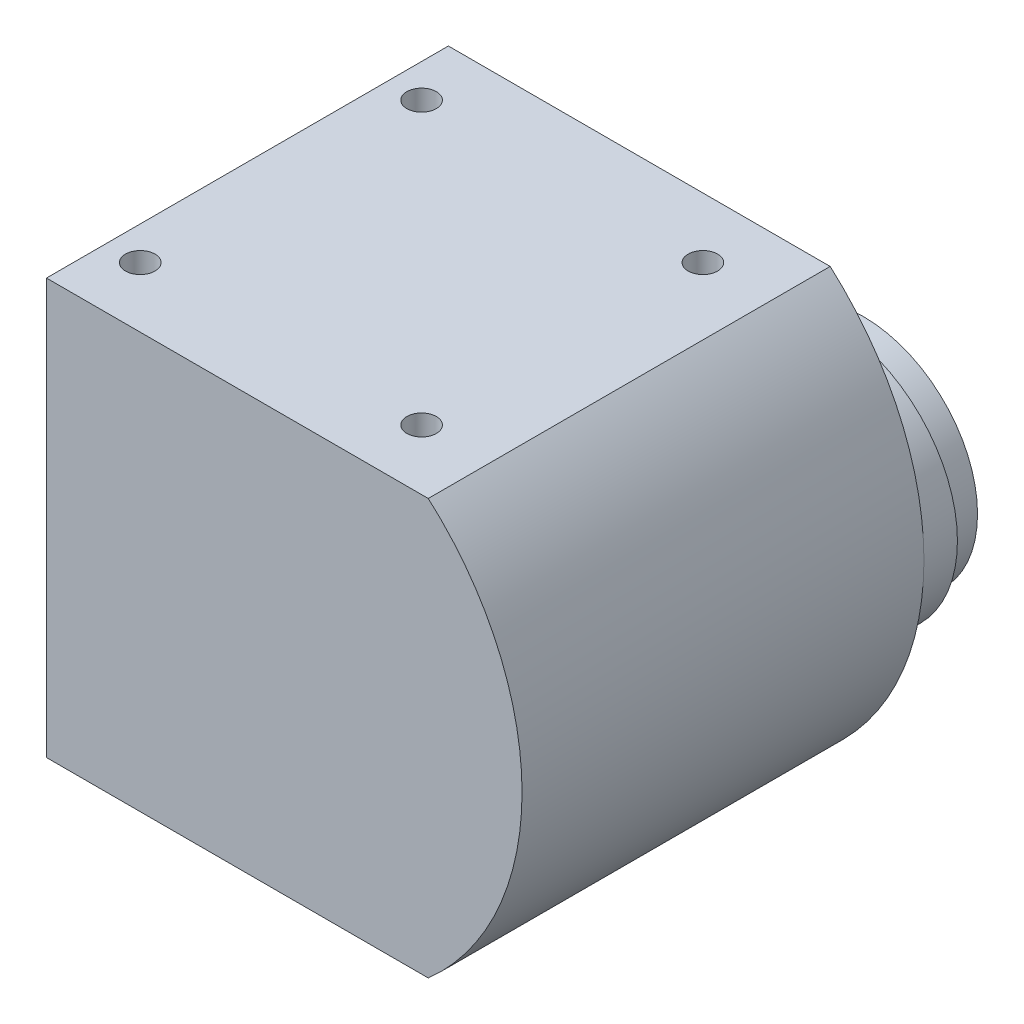
ISO-10303-21;
HEADER;
FILE_DESCRIPTION(('STEP AP214'),'2;1');
FILE_NAME('part.step','',(''),(''),'','','');
FILE_SCHEMA(('AUTOMOTIVE_DESIGN { 1 0 10303 214 1 1 1 1 }'));
ENDSEC;
DATA;
#1=APPLICATION_CONTEXT('core data for automotive mechanical design processes');
#2=APPLICATION_PROTOCOL_DEFINITION('international standard','automotive_design',2000,#1);
#3=PRODUCT_CONTEXT('',#1,'mechanical');
#4=PRODUCT('Part','Part','',(#3));
#5=PRODUCT_RELATED_PRODUCT_CATEGORY('part','',(#4));
#6=PRODUCT_DEFINITION_FORMATION('','',#4);
#7=PRODUCT_DEFINITION_CONTEXT('part definition',#1,'design');
#8=PRODUCT_DEFINITION('design','',#6,#7);
#9=PRODUCT_DEFINITION_SHAPE('','',#8);
#10=(LENGTH_UNIT() NAMED_UNIT(*) SI_UNIT(.MILLI.,.METRE.));
#11=(NAMED_UNIT(*) PLANE_ANGLE_UNIT() SI_UNIT($,.RADIAN.));
#12=(NAMED_UNIT(*) SI_UNIT($,.STERADIAN.) SOLID_ANGLE_UNIT());
#13=UNCERTAINTY_MEASURE_WITH_UNIT(LENGTH_MEASURE(1.E-05),#10,'distance_accuracy_value','');
#14=(GEOMETRIC_REPRESENTATION_CONTEXT(3) GLOBAL_UNCERTAINTY_ASSIGNED_CONTEXT((#13)) GLOBAL_UNIT_ASSIGNED_CONTEXT((#10,
#11,#12)) REPRESENTATION_CONTEXT('',''));
#15=CARTESIAN_POINT('',(0.,0.,0.));
#16=DIRECTION('',(0.,0.,1.));
#17=DIRECTION('',(1.,0.,0.));
#18=AXIS2_PLACEMENT_3D('',#15,#16,#17);
#19=CARTESIAN_POINT('',(-26.,13.,33.));
#20=DIRECTION('',(0.,1.,0.));
#21=DIRECTION('',(0.,0.,1.));
#22=AXIS2_PLACEMENT_3D('',#19,#20,#21);
#23=PLANE('',#22);
#24=CARTESIAN_POINT('',(-23.4999999999998,13.,30.4999999999999));
#25=DIRECTION('',(0.,1.,0.));
#26=DIRECTION('',(0.,0.,1.));
#27=AXIS2_PLACEMENT_3D('',#24,#25,#26);
#28=CIRCLE('',#27,1.1);
#29=CARTESIAN_POINT('',(-23.4999999999998,13.,31.5999999999999));
#30=VERTEX_POINT('',#29);
#31=EDGE_CURVE('E132',#30,#30,#28,.T.);
#32=ORIENTED_EDGE('',*,*,#31,.T.);
#33=EDGE_LOOP('',(#32));
#34=FACE_BOUND('',#33,.T.);
#35=CARTESIAN_POINT('',(-2.49999999999978,13.,30.4999999999998));
#36=DIRECTION('',(0.,1.,0.));
#37=DIRECTION('',(0.,0.,1.));
#38=AXIS2_PLACEMENT_3D('',#35,#36,#37);
#39=CIRCLE('',#38,1.1);
#40=CARTESIAN_POINT('',(-2.49999999999978,13.,31.5999999999998));
#41=VERTEX_POINT('',#40);
#42=EDGE_CURVE('E290',#41,#41,#39,.T.);
#43=ORIENTED_EDGE('',*,*,#42,.T.);
#44=EDGE_LOOP('',(#43));
#45=FACE_BOUND('',#44,.T.);
#46=CARTESIAN_POINT('',(-2.49999999999996,13.,9.49999999999974));
#47=DIRECTION('',(0.,1.,0.));
#48=DIRECTION('',(0.,0.,1.));
#49=AXIS2_PLACEMENT_3D('',#46,#47,#48);
#50=CIRCLE('',#49,1.1);
#51=CARTESIAN_POINT('',(-2.49999999999996,13.,10.5999999999997));
#52=VERTEX_POINT('',#51);
#53=EDGE_CURVE('E277',#52,#52,#50,.T.);
#54=ORIENTED_EDGE('',*,*,#53,.T.);
#55=EDGE_LOOP('',(#54));
#56=FACE_BOUND('',#55,.T.);
#57=CARTESIAN_POINT('',(-23.5,13.,9.5));
#58=DIRECTION('',(0.,1.,0.));
#59=DIRECTION('',(0.,0.,1.));
#60=AXIS2_PLACEMENT_3D('',#57,#58,#59);
#61=CIRCLE('',#60,1.1);
#62=CARTESIAN_POINT('',(-23.5,13.,10.6));
#63=VERTEX_POINT('',#62);
#64=EDGE_CURVE('E278',#63,#63,#61,.T.);
#65=ORIENTED_EDGE('',*,*,#64,.T.);
#66=EDGE_LOOP('',(#65));
#67=FACE_BOUND('',#66,.T.);
#68=DIRECTION('',(1.,0.,0.));
#69=VECTOR('',#68,1.);
#70=CARTESIAN_POINT('',(0.,13.,7.));
#71=LINE('',#70,#69);
#72=CARTESIAN_POINT('',(-26.,13.,7.));
#73=VERTEX_POINT('',#72);
#74=CARTESIAN_POINT('',(0.,13.,7.));
#75=VERTEX_POINT('',#74);
#76=EDGE_CURVE('E48',#73,#75,#71,.T.);
#77=ORIENTED_EDGE('',*,*,#76,.T.);
#78=DIRECTION('',(0.,0.,-1.));
#79=VECTOR('',#78,1.);
#80=CARTESIAN_POINT('',(0.,13.,33.));
#81=LINE('',#80,#79);
#82=CARTESIAN_POINT('',(0.,13.,33.));
#83=VERTEX_POINT('',#82);
#84=EDGE_CURVE('E176',#83,#75,#81,.T.);
#85=ORIENTED_EDGE('',*,*,#84,.F.);
#86=DIRECTION('',(1.,0.,0.));
#87=VECTOR('',#86,1.);
#88=CARTESIAN_POINT('',(-26.,13.,33.));
#89=LINE('',#88,#87);
#90=CARTESIAN_POINT('',(-26.,13.,33.));
#91=VERTEX_POINT('',#90);
#92=EDGE_CURVE('E147',#91,#83,#89,.T.);
#93=ORIENTED_EDGE('',*,*,#92,.F.);
#94=DIRECTION('',(0.,0.,-1.));
#95=VECTOR('',#94,1.);
#96=CARTESIAN_POINT('',(-26.,13.,33.));
#97=LINE('',#96,#95);
#98=EDGE_CURVE('E157',#91,#73,#97,.T.);
#99=ORIENTED_EDGE('',*,*,#98,.T.);
#100=EDGE_LOOP('',(#77,#85,#93,#99));
#101=FACE_BOUND('',#100,.T.);
#102=ADVANCED_FACE('F33',(#34,#45,#56,#67,#101),#23,.F.);
#103=CARTESIAN_POINT('',(0.,13.,33.));
#104=DIRECTION('',(1.,0.,0.));
#105=DIRECTION('',(0.,0.,-1.));
#106=AXIS2_PLACEMENT_3D('',#103,#104,#105);
#107=PLANE('',#106);
#108=DIRECTION('',(0.,-1.,0.));
#109=VECTOR('',#108,1.);
#110=CARTESIAN_POINT('',(0.,13.,7.));
#111=LINE('',#110,#109);
#112=CARTESIAN_POINT('',(0.,-13.,7.));
#113=VERTEX_POINT('',#112);
#114=EDGE_CURVE('E55',#75,#113,#111,.T.);
#115=ORIENTED_EDGE('',*,*,#114,.T.);
#116=DIRECTION('',(0.,0.,-1.));
#117=VECTOR('',#116,1.);
#118=CARTESIAN_POINT('',(0.,-13.,33.));
#119=LINE('',#118,#117);
#120=CARTESIAN_POINT('',(0.,-13.,33.));
#121=VERTEX_POINT('',#120);
#122=EDGE_CURVE('E174',#121,#113,#119,.T.);
#123=ORIENTED_EDGE('',*,*,#122,.F.);
#124=DIRECTION('',(0.,-1.,0.));
#125=VECTOR('',#124,1.);
#126=CARTESIAN_POINT('',(0.,13.,33.));
#127=LINE('',#126,#125);
#128=EDGE_CURVE('E150',#83,#121,#127,.T.);
#129=ORIENTED_EDGE('',*,*,#128,.F.);
#130=ORIENTED_EDGE('',*,*,#84,.T.);
#131=EDGE_LOOP('',(#115,#123,#129,#130));
#132=FACE_BOUND('',#131,.T.);
#133=ADVANCED_FACE('F203',(#132),#107,.F.);
#134=CARTESIAN_POINT('',(0.,-13.,33.));
#135=DIRECTION('',(0.,-1.,0.));
#136=DIRECTION('',(0.,0.,-1.));
#137=AXIS2_PLACEMENT_3D('',#134,#135,#136);
#138=PLANE('',#137);
#139=CARTESIAN_POINT('',(-23.4999999999998,-13.,30.4999999999999));
#140=DIRECTION('',(0.,-1.,0.));
#141=DIRECTION('',(0.,0.,-1.));
#142=AXIS2_PLACEMENT_3D('',#139,#140,#141);
#143=CIRCLE('',#142,1.1);
#144=CARTESIAN_POINT('',(-23.4999999999998,-13.,29.3999999999999));
#145=VERTEX_POINT('',#144);
#146=EDGE_CURVE('E292',#145,#145,#143,.T.);
#147=ORIENTED_EDGE('',*,*,#146,.T.);
#148=EDGE_LOOP('',(#147));
#149=FACE_BOUND('',#148,.T.);
#150=CARTESIAN_POINT('',(-2.49999999999978,-13.,30.4999999999998));
#151=DIRECTION('',(0.,-1.,0.));
#152=DIRECTION('',(0.,0.,-1.));
#153=AXIS2_PLACEMENT_3D('',#150,#151,#152);
#154=CIRCLE('',#153,1.1);
#155=CARTESIAN_POINT('',(-2.49999999999978,-13.,29.3999999999998));
#156=VERTEX_POINT('',#155);
#157=EDGE_CURVE('E281',#156,#156,#154,.T.);
#158=ORIENTED_EDGE('',*,*,#157,.T.);
#159=EDGE_LOOP('',(#158));
#160=FACE_BOUND('',#159,.T.);
#161=CARTESIAN_POINT('',(-2.49999999999996,-13.,9.49999999999974));
#162=DIRECTION('',(0.,-1.,0.));
#163=DIRECTION('',(0.,0.,-1.));
#164=AXIS2_PLACEMENT_3D('',#161,#162,#163);
#165=CIRCLE('',#164,1.1);
#166=CARTESIAN_POINT('',(-2.49999999999996,-13.,8.39999999999974));
#167=VERTEX_POINT('',#166);
#168=EDGE_CURVE('E275',#167,#167,#165,.T.);
#169=ORIENTED_EDGE('',*,*,#168,.T.);
#170=EDGE_LOOP('',(#169));
#171=FACE_BOUND('',#170,.T.);
#172=CARTESIAN_POINT('',(-23.5,-13.,9.5));
#173=DIRECTION('',(0.,-1.,0.));
#174=DIRECTION('',(0.,0.,-1.));
#175=AXIS2_PLACEMENT_3D('',#172,#173,#174);
#176=CIRCLE('',#175,1.1);
#177=CARTESIAN_POINT('',(-23.5,-13.,8.4));
#178=VERTEX_POINT('',#177);
#179=EDGE_CURVE('E284',#178,#178,#176,.T.);
#180=ORIENTED_EDGE('',*,*,#179,.T.);
#181=EDGE_LOOP('',(#180));
#182=FACE_BOUND('',#181,.T.);
#183=DIRECTION('',(-1.,0.,0.));
#184=VECTOR('',#183,1.);
#185=CARTESIAN_POINT('',(0.,-13.,7.));
#186=LINE('',#185,#184);
#187=CARTESIAN_POINT('',(-26.,-13.,7.));
#188=VERTEX_POINT('',#187);
#189=EDGE_CURVE('E140',#113,#188,#186,.T.);
#190=ORIENTED_EDGE('',*,*,#189,.T.);
#191=DIRECTION('',(0.,0.,-1.));
#192=VECTOR('',#191,1.);
#193=CARTESIAN_POINT('',(-26.,-13.,33.));
#194=LINE('',#193,#192);
#195=CARTESIAN_POINT('',(-26.,-13.,33.));
#196=VERTEX_POINT('',#195);
#197=EDGE_CURVE('E171',#196,#188,#194,.T.);
#198=ORIENTED_EDGE('',*,*,#197,.F.);
#199=DIRECTION('',(-1.,0.,0.));
#200=VECTOR('',#199,1.);
#201=CARTESIAN_POINT('',(0.,-13.,33.));
#202=LINE('',#201,#200);
#203=EDGE_CURVE('E154',#121,#196,#202,.T.);
#204=ORIENTED_EDGE('',*,*,#203,.F.);
#205=ORIENTED_EDGE('',*,*,#122,.T.);
#206=EDGE_LOOP('',(#190,#198,#204,#205));
#207=FACE_BOUND('',#206,.T.);
#208=ADVANCED_FACE('F208',(#149,#160,#171,#182,#207),#138,.F.);
#209=CARTESIAN_POINT('',(0.,0.,2.5));
#210=DIRECTION('',(0.,0.,-1.));
#211=DIRECTION('',(-1.,0.,0.));
#212=AXIS2_PLACEMENT_3D('',#209,#210,#211);
#213=CYLINDRICAL_SURFACE('',#212,8.5);
#214=CARTESIAN_POINT('',(0.,0.,2.5));
#215=DIRECTION('',(0.,0.,1.));
#216=DIRECTION('',(1.,0.,0.));
#217=AXIS2_PLACEMENT_3D('',#214,#215,#216);
#218=CIRCLE('',#217,8.5);
#219=CARTESIAN_POINT('',(8.5,0.,2.5));
#220=VERTEX_POINT('',#219);
#221=EDGE_CURVE('E11',#220,#220,#218,.T.);
#222=ORIENTED_EDGE('',*,*,#221,.F.);
#223=EDGE_LOOP('',(#222));
#224=FACE_BOUND('',#223,.T.);
#225=CARTESIAN_POINT('',(0.,0.,0.));
#226=DIRECTION('',(0.,0.,1.));
#227=DIRECTION('',(1.,0.,0.));
#228=AXIS2_PLACEMENT_3D('',#225,#226,#227);
#229=CIRCLE('',#228,8.5);
#230=CARTESIAN_POINT('',(8.5,0.,0.));
#231=VERTEX_POINT('',#230);
#232=EDGE_CURVE('E37',#231,#231,#229,.T.);
#233=ORIENTED_EDGE('',*,*,#232,.T.);
#234=EDGE_LOOP('',(#233));
#235=FACE_BOUND('',#234,.T.);
#236=ADVANCED_FACE('F35',(#224,#235),#213,.T.);
#237=CARTESIAN_POINT('',(0.,0.,0.));
#238=DIRECTION('',(0.,0.,1.));
#239=DIRECTION('',(1.,0.,0.));
#240=AXIS2_PLACEMENT_3D('',#237,#238,#239);
#241=PLANE('',#240);
#242=ORIENTED_EDGE('',*,*,#232,.F.);
#243=EDGE_LOOP('',(#242));
#244=FACE_BOUND('',#243,.T.);
#245=ADVANCED_FACE('F198',(#244),#241,.F.);
#246=CARTESIAN_POINT('',(0.,0.,5.));
#247=DIRECTION('',(0.,0.,-1.));
#248=DIRECTION('',(-1.,0.,0.));
#249=AXIS2_PLACEMENT_3D('',#246,#247,#248);
#250=CYLINDRICAL_SURFACE('',#249,9.5);
#251=CARTESIAN_POINT('',(0.,0.,5.));
#252=DIRECTION('',(0.,0.,1.));
#253=DIRECTION('',(1.,0.,0.));
#254=AXIS2_PLACEMENT_3D('',#251,#252,#253);
#255=CIRCLE('',#254,9.5);
#256=CARTESIAN_POINT('',(9.5,0.,5.));
#257=VERTEX_POINT('',#256);
#258=EDGE_CURVE('E179',#257,#257,#255,.T.);
#259=ORIENTED_EDGE('',*,*,#258,.F.);
#260=EDGE_LOOP('',(#259));
#261=FACE_BOUND('',#260,.T.);
#262=CARTESIAN_POINT('',(0.,0.,2.5));
#263=DIRECTION('',(0.,0.,1.));
#264=DIRECTION('',(1.,0.,0.));
#265=AXIS2_PLACEMENT_3D('',#262,#263,#264);
#266=CIRCLE('',#265,9.5);
#267=CARTESIAN_POINT('',(9.5,0.,2.5));
#268=VERTEX_POINT('',#267);
#269=EDGE_CURVE('E178',#268,#268,#266,.T.);
#270=ORIENTED_EDGE('',*,*,#269,.T.);
#271=EDGE_LOOP('',(#270));
#272=FACE_BOUND('',#271,.T.);
#273=ADVANCED_FACE('F184',(#261,#272),#250,.T.);
#274=CARTESIAN_POINT('',(0.,0.,2.5));
#275=DIRECTION('',(0.,0.,1.));
#276=DIRECTION('',(1.,0.,0.));
#277=AXIS2_PLACEMENT_3D('',#274,#275,#276);
#278=PLANE('',#277);
#279=ORIENTED_EDGE('',*,*,#221,.T.);
#280=EDGE_LOOP('',(#279));
#281=FACE_BOUND('',#280,.T.);
#282=ORIENTED_EDGE('',*,*,#269,.F.);
#283=EDGE_LOOP('',(#282));
#284=FACE_BOUND('',#283,.T.);
#285=ADVANCED_FACE('F186',(#281,#284),#278,.F.);
#286=CARTESIAN_POINT('',(-11.1607142857142,0.,5.));
#287=DIRECTION('',(0.,0.,1.));
#288=DIRECTION('',(1.,0.,0.));
#289=AXIS2_PLACEMENT_3D('',#286,#287,#288);
#290=PLANE('',#289);
#291=CARTESIAN_POINT('',(-11.1607142857142,0.,5.));
#292=DIRECTION('',(0.,0.,1.));
#293=DIRECTION('',(1.,0.,0.));
#294=AXIS2_PLACEMENT_3D('',#291,#292,#293);
#295=CIRCLE('',#294,20.6607142857142);
#296=CARTESIAN_POINT('',(2.5,15.5,5.));
#297=VERTEX_POINT('',#296);
#298=EDGE_CURVE('E160',#257,#297,#295,.T.);
#299=ORIENTED_EDGE('',*,*,#298,.F.);
#300=ORIENTED_EDGE('',*,*,#258,.T.);
#301=CARTESIAN_POINT('',(2.50000000000001,-15.5,5.));
#302=VERTEX_POINT('',#301);
#303=EDGE_CURVE('E161',#302,#257,#295,.T.);
#304=ORIENTED_EDGE('',*,*,#303,.F.);
#305=DIRECTION('',(1.,0.,0.));
#306=VECTOR('',#305,1.);
#307=CARTESIAN_POINT('',(2.5,-15.5,5.));
#308=LINE('',#307,#306);
#309=CARTESIAN_POINT('',(-26.,-15.5,5.));
#310=VERTEX_POINT('',#309);
#311=EDGE_CURVE('E109',#310,#302,#308,.T.);
#312=ORIENTED_EDGE('',*,*,#311,.F.);
#313=DIRECTION('',(0.,-1.,0.));
#314=VECTOR('',#313,1.);
#315=CARTESIAN_POINT('',(-26.,-13.,5.));
#316=LINE('',#315,#314);
#317=CARTESIAN_POINT('',(-26.,15.5,5.));
#318=VERTEX_POINT('',#317);
#319=EDGE_CURVE('E146',#318,#310,#316,.T.);
#320=ORIENTED_EDGE('',*,*,#319,.F.);
#321=DIRECTION('',(-1.,0.,0.));
#322=VECTOR('',#321,1.);
#323=CARTESIAN_POINT('',(-26.,15.5,5.));
#324=LINE('',#323,#322);
#325=EDGE_CURVE('E151',#297,#318,#324,.T.);
#326=ORIENTED_EDGE('',*,*,#325,.F.);
#327=EDGE_LOOP('',(#299,#300,#304,#312,#320,#326));
#328=FACE_BOUND('',#327,.T.);
#329=ADVANCED_FACE('F188',(#328),#290,.F.);
#330=CARTESIAN_POINT('',(-26.,-13.,33.));
#331=DIRECTION('',(1.,0.,0.));
#332=DIRECTION('',(0.,0.,-1.));
#333=AXIS2_PLACEMENT_3D('',#330,#331,#332);
#334=PLANE('',#333);
#335=DIRECTION('',(0.,0.,-1.));
#336=VECTOR('',#335,1.);
#337=CARTESIAN_POINT('',(-26.,-15.5,33.));
#338=LINE('',#337,#336);
#339=CARTESIAN_POINT('',(-26.,-15.5,35.));
#340=VERTEX_POINT('',#339);
#341=EDGE_CURVE('E113',#340,#310,#338,.T.);
#342=ORIENTED_EDGE('',*,*,#341,.F.);
#343=DIRECTION('',(0.,-1.,0.));
#344=VECTOR('',#343,1.);
#345=CARTESIAN_POINT('',(-26.,15.5,35.));
#346=LINE('',#345,#344);
#347=CARTESIAN_POINT('',(-26.,15.5,35.));
#348=VERTEX_POINT('',#347);
#349=EDGE_CURVE('E128',#348,#340,#346,.T.);
#350=ORIENTED_EDGE('',*,*,#349,.F.);
#351=DIRECTION('',(0.,0.,-1.));
#352=VECTOR('',#351,1.);
#353=CARTESIAN_POINT('',(-26.,15.5,33.));
#354=LINE('',#353,#352);
#355=EDGE_CURVE('E166',#348,#318,#354,.T.);
#356=ORIENTED_EDGE('',*,*,#355,.T.);
#357=ORIENTED_EDGE('',*,*,#319,.T.);
#358=EDGE_LOOP('',(#342,#350,#356,#357));
#359=FACE_BOUND('',#358,.T.);
#360=DIRECTION('',(0.,-1.,0.));
#361=VECTOR('',#360,1.);
#362=CARTESIAN_POINT('',(-26.,15.5,33.));
#363=LINE('',#362,#361);
#364=EDGE_CURVE('E129',#91,#196,#363,.T.);
#365=ORIENTED_EDGE('',*,*,#364,.T.);
#366=ORIENTED_EDGE('',*,*,#197,.T.);
#367=DIRECTION('',(0.,1.,0.));
#368=VECTOR('',#367,1.);
#369=CARTESIAN_POINT('',(-26.,13.,7.));
#370=LINE('',#369,#368);
#371=EDGE_CURVE('E142',#188,#73,#370,.T.);
#372=ORIENTED_EDGE('',*,*,#371,.T.);
#373=ORIENTED_EDGE('',*,*,#98,.F.);
#374=EDGE_LOOP('',(#365,#366,#372,#373));
#375=FACE_BOUND('',#374,.T.);
#376=ADVANCED_FACE('F195',(#359,#375),#334,.F.);
#377=CARTESIAN_POINT('',(2.5,-15.5,33.));
#378=DIRECTION('',(0.,1.,0.));
#379=DIRECTION('',(-1.,0.,0.));
#380=AXIS2_PLACEMENT_3D('',#377,#378,#379);
#381=PLANE('',#380);
#382=CARTESIAN_POINT('',(-23.4999999999998,-15.5,30.4999999999999));
#383=DIRECTION('',(0.,1.,0.));
#384=DIRECTION('',(-1.,0.,0.));
#385=AXIS2_PLACEMENT_3D('',#382,#383,#384);
#386=CIRCLE('',#385,1.1);
#387=CARTESIAN_POINT('',(-24.5999999999998,-15.5,30.4999999999999));
#388=VERTEX_POINT('',#387);
#389=EDGE_CURVE('E305',#388,#388,#386,.T.);
#390=ORIENTED_EDGE('',*,*,#389,.T.);
#391=EDGE_LOOP('',(#390));
#392=FACE_BOUND('',#391,.T.);
#393=CARTESIAN_POINT('',(-2.49999999999978,-15.5,30.4999999999998));
#394=DIRECTION('',(0.,1.,0.));
#395=DIRECTION('',(-1.,0.,0.));
#396=AXIS2_PLACEMENT_3D('',#393,#394,#395);
#397=CIRCLE('',#396,1.1);
#398=CARTESIAN_POINT('',(-3.59999999999978,-15.5,30.4999999999998));
#399=VERTEX_POINT('',#398);
#400=EDGE_CURVE('E310',#399,#399,#397,.T.);
#401=ORIENTED_EDGE('',*,*,#400,.T.);
#402=EDGE_LOOP('',(#401));
#403=FACE_BOUND('',#402,.T.);
#404=CARTESIAN_POINT('',(-2.49999999999996,-15.5,9.49999999999974));
#405=DIRECTION('',(0.,1.,0.));
#406=DIRECTION('',(-1.,0.,0.));
#407=AXIS2_PLACEMENT_3D('',#404,#405,#406);
#408=CIRCLE('',#407,1.1);
#409=CARTESIAN_POINT('',(-3.59999999999996,-15.5,9.49999999999974));
#410=VERTEX_POINT('',#409);
#411=EDGE_CURVE('E272',#410,#410,#408,.T.);
#412=ORIENTED_EDGE('',*,*,#411,.T.);
#413=EDGE_LOOP('',(#412));
#414=FACE_BOUND('',#413,.T.);
#415=CARTESIAN_POINT('',(-23.5,-15.5,9.5));
#416=DIRECTION('',(0.,1.,0.));
#417=DIRECTION('',(-1.,0.,0.));
#418=AXIS2_PLACEMENT_3D('',#415,#416,#417);
#419=CIRCLE('',#418,1.1);
#420=CARTESIAN_POINT('',(-24.6,-15.5,9.5));
#421=VERTEX_POINT('',#420);
#422=EDGE_CURVE('E316',#421,#421,#419,.T.);
#423=ORIENTED_EDGE('',*,*,#422,.T.);
#424=EDGE_LOOP('',(#423));
#425=FACE_BOUND('',#424,.T.);
#426=ORIENTED_EDGE('',*,*,#311,.T.);
#427=DIRECTION('',(0.,0.,-1.));
#428=VECTOR('',#427,1.);
#429=CARTESIAN_POINT('',(2.50000000000001,-15.5,33.));
#430=LINE('',#429,#428);
#431=CARTESIAN_POINT('',(2.50000000000001,-15.5,35.));
#432=VERTEX_POINT('',#431);
#433=EDGE_CURVE('E102',#432,#302,#430,.T.);
#434=ORIENTED_EDGE('',*,*,#433,.F.);
#435=DIRECTION('',(1.,0.,0.));
#436=VECTOR('',#435,1.);
#437=CARTESIAN_POINT('',(-26.,-15.5,35.));
#438=LINE('',#437,#436);
#439=EDGE_CURVE('E107',#340,#432,#438,.T.);
#440=ORIENTED_EDGE('',*,*,#439,.F.);
#441=ORIENTED_EDGE('',*,*,#341,.T.);
#442=EDGE_LOOP('',(#426,#434,#440,#441));
#443=FACE_BOUND('',#442,.T.);
#444=ADVANCED_FACE('F104',(#392,#403,#414,#425,#443),#381,.F.);
#445=CARTESIAN_POINT('',(-11.1607142857142,0.,33.));
#446=DIRECTION('',(0.,0.,-1.));
#447=DIRECTION('',(-1.,0.,0.));
#448=AXIS2_PLACEMENT_3D('',#445,#446,#447);
#449=CYLINDRICAL_SURFACE('',#448,20.6607142857142);
#450=ORIENTED_EDGE('',*,*,#303,.T.);
#451=ORIENTED_EDGE('',*,*,#298,.T.);
#452=DIRECTION('',(0.,0.,-1.));
#453=VECTOR('',#452,1.);
#454=CARTESIAN_POINT('',(2.5,15.5,33.));
#455=LINE('',#454,#453);
#456=CARTESIAN_POINT('',(2.5,15.5,35.));
#457=VERTEX_POINT('',#456);
#458=EDGE_CURVE('E114',#457,#297,#455,.T.);
#459=ORIENTED_EDGE('',*,*,#458,.F.);
#460=CARTESIAN_POINT('',(-11.1607142857142,0.,35.));
#461=DIRECTION('',(0.,0.,1.));
#462=DIRECTION('',(1.,0.,0.));
#463=AXIS2_PLACEMENT_3D('',#460,#461,#462);
#464=CIRCLE('',#463,20.6607142857142);
#465=EDGE_CURVE('E117',#432,#457,#464,.T.);
#466=ORIENTED_EDGE('',*,*,#465,.F.);
#467=ORIENTED_EDGE('',*,*,#433,.T.);
#468=EDGE_LOOP('',(#450,#451,#459,#466,#467));
#469=FACE_BOUND('',#468,.T.);
#470=ADVANCED_FACE('F118',(#469),#449,.T.);
#471=CARTESIAN_POINT('',(-26.,15.5,33.));
#472=DIRECTION('',(0.,-1.,0.));
#473=DIRECTION('',(1.,0.,0.));
#474=AXIS2_PLACEMENT_3D('',#471,#472,#473);
#475=PLANE('',#474);
#476=CARTESIAN_POINT('',(-23.4999999999998,15.5,30.4999999999999));
#477=DIRECTION('',(0.,1.,0.));
#478=DIRECTION('',(-1.,0.,0.));
#479=AXIS2_PLACEMENT_3D('',#476,#477,#478);
#480=CIRCLE('',#479,1.1);
#481=CARTESIAN_POINT('',(-24.5999999999998,15.5,30.4999999999999));
#482=VERTEX_POINT('',#481);
#483=EDGE_CURVE('E307',#482,#482,#480,.T.);
#484=ORIENTED_EDGE('',*,*,#483,.F.);
#485=EDGE_LOOP('',(#484));
#486=FACE_BOUND('',#485,.T.);
#487=CARTESIAN_POINT('',(-2.49999999999978,15.5,30.4999999999998));
#488=DIRECTION('',(0.,1.,0.));
#489=DIRECTION('',(-1.,0.,0.));
#490=AXIS2_PLACEMENT_3D('',#487,#488,#489);
#491=CIRCLE('',#490,1.1);
#492=CARTESIAN_POINT('',(-3.59999999999978,15.5,30.4999999999998));
#493=VERTEX_POINT('',#492);
#494=EDGE_CURVE('E306',#493,#493,#491,.T.);
#495=ORIENTED_EDGE('',*,*,#494,.F.);
#496=EDGE_LOOP('',(#495));
#497=FACE_BOUND('',#496,.T.);
#498=CARTESIAN_POINT('',(-2.49999999999996,15.5,9.49999999999974));
#499=DIRECTION('',(0.,1.,0.));
#500=DIRECTION('',(-1.,0.,0.));
#501=AXIS2_PLACEMENT_3D('',#498,#499,#500);
#502=CIRCLE('',#501,1.1);
#503=CARTESIAN_POINT('',(-3.59999999999996,15.5,9.49999999999974));
#504=VERTEX_POINT('',#503);
#505=EDGE_CURVE('E333',#504,#504,#502,.T.);
#506=ORIENTED_EDGE('',*,*,#505,.F.);
#507=EDGE_LOOP('',(#506));
#508=FACE_BOUND('',#507,.T.);
#509=CARTESIAN_POINT('',(-23.5,15.5,9.5));
#510=DIRECTION('',(0.,1.,0.));
#511=DIRECTION('',(-1.,0.,0.));
#512=AXIS2_PLACEMENT_3D('',#509,#510,#511);
#513=CIRCLE('',#512,1.1);
#514=CARTESIAN_POINT('',(-24.6,15.5,9.5));
#515=VERTEX_POINT('',#514);
#516=EDGE_CURVE('E319',#515,#515,#513,.T.);
#517=ORIENTED_EDGE('',*,*,#516,.F.);
#518=EDGE_LOOP('',(#517));
#519=FACE_BOUND('',#518,.T.);
#520=ORIENTED_EDGE('',*,*,#325,.T.);
#521=ORIENTED_EDGE('',*,*,#355,.F.);
#522=DIRECTION('',(-1.,0.,0.));
#523=VECTOR('',#522,1.);
#524=CARTESIAN_POINT('',(2.5,15.5,35.));
#525=LINE('',#524,#523);
#526=EDGE_CURVE('E123',#457,#348,#525,.T.);
#527=ORIENTED_EDGE('',*,*,#526,.F.);
#528=ORIENTED_EDGE('',*,*,#458,.T.);
#529=EDGE_LOOP('',(#520,#521,#527,#528));
#530=FACE_BOUND('',#529,.T.);
#531=ADVANCED_FACE('F224',(#486,#497,#508,#519,#530),#475,.F.);
#532=CARTESIAN_POINT('',(0.,0.,7.));
#533=DIRECTION('',(0.,0.,-1.));
#534=DIRECTION('',(-1.,0.,0.));
#535=AXIS2_PLACEMENT_3D('',#532,#533,#534);
#536=PLANE('',#535);
#537=ORIENTED_EDGE('',*,*,#114,.F.);
#538=ORIENTED_EDGE('',*,*,#76,.F.);
#539=ORIENTED_EDGE('',*,*,#371,.F.);
#540=ORIENTED_EDGE('',*,*,#189,.F.);
#541=EDGE_LOOP('',(#537,#538,#539,#540));
#542=FACE_BOUND('',#541,.T.);
#543=ADVANCED_FACE('F226',(#542),#536,.F.);
#544=CARTESIAN_POINT('',(-11.1607142857142,0.,33.));
#545=DIRECTION('',(0.,0.,1.));
#546=DIRECTION('',(1.,0.,0.));
#547=AXIS2_PLACEMENT_3D('',#544,#545,#546);
#548=PLANE('',#547);
#549=ORIENTED_EDGE('',*,*,#364,.F.);
#550=ORIENTED_EDGE('',*,*,#92,.T.);
#551=ORIENTED_EDGE('',*,*,#128,.T.);
#552=ORIENTED_EDGE('',*,*,#203,.T.);
#553=EDGE_LOOP('',(#549,#550,#551,#552));
#554=FACE_BOUND('',#553,.T.);
#555=ADVANCED_FACE('F231',(#554),#548,.F.);
#556=CARTESIAN_POINT('',(-11.1607142857142,0.,35.));
#557=DIRECTION('',(0.,0.,1.));
#558=DIRECTION('',(1.,0.,0.));
#559=AXIS2_PLACEMENT_3D('',#556,#557,#558);
#560=PLANE('',#559);
#561=ORIENTED_EDGE('',*,*,#439,.T.);
#562=ORIENTED_EDGE('',*,*,#465,.T.);
#563=ORIENTED_EDGE('',*,*,#526,.T.);
#564=ORIENTED_EDGE('',*,*,#349,.T.);
#565=EDGE_LOOP('',(#561,#562,#563,#564));
#566=FACE_BOUND('',#565,.T.);
#567=ADVANCED_FACE('F126',(#566),#560,.T.);
#568=CARTESIAN_POINT('',(-23.5,-15.5,9.5));
#569=DIRECTION('',(0.,1.,0.));
#570=DIRECTION('',(-1.,0.,0.));
#571=AXIS2_PLACEMENT_3D('',#568,#569,#570);
#572=CYLINDRICAL_SURFACE('',#571,1.1);
#573=ORIENTED_EDGE('',*,*,#516,.T.);
#574=EDGE_LOOP('',(#573));
#575=FACE_BOUND('',#574,.T.);
#576=ORIENTED_EDGE('',*,*,#64,.F.);
#577=EDGE_LOOP('',(#576));
#578=FACE_BOUND('',#577,.T.);
#579=ADVANCED_FACE('F238',(#575,#578),#572,.F.);
#580=CARTESIAN_POINT('',(-2.49999999999996,-15.5,9.49999999999974));
#581=DIRECTION('',(0.,1.,0.));
#582=DIRECTION('',(-1.,0.,0.));
#583=AXIS2_PLACEMENT_3D('',#580,#581,#582);
#584=CYLINDRICAL_SURFACE('',#583,1.1);
#585=ORIENTED_EDGE('',*,*,#505,.T.);
#586=EDGE_LOOP('',(#585));
#587=FACE_BOUND('',#586,.T.);
#588=ORIENTED_EDGE('',*,*,#53,.F.);
#589=EDGE_LOOP('',(#588));
#590=FACE_BOUND('',#589,.T.);
#591=ADVANCED_FACE('F241',(#587,#590),#584,.F.);
#592=CARTESIAN_POINT('',(-2.49999999999978,-15.5,30.4999999999998));
#593=DIRECTION('',(0.,1.,0.));
#594=DIRECTION('',(-1.,0.,0.));
#595=AXIS2_PLACEMENT_3D('',#592,#593,#594);
#596=CYLINDRICAL_SURFACE('',#595,1.1);
#597=ORIENTED_EDGE('',*,*,#494,.T.);
#598=EDGE_LOOP('',(#597));
#599=FACE_BOUND('',#598,.T.);
#600=ORIENTED_EDGE('',*,*,#42,.F.);
#601=EDGE_LOOP('',(#600));
#602=FACE_BOUND('',#601,.T.);
#603=ADVANCED_FACE('F247',(#599,#602),#596,.F.);
#604=CARTESIAN_POINT('',(-23.4999999999998,-15.5,30.4999999999999));
#605=DIRECTION('',(0.,1.,0.));
#606=DIRECTION('',(-1.,0.,0.));
#607=AXIS2_PLACEMENT_3D('',#604,#605,#606);
#608=CYLINDRICAL_SURFACE('',#607,1.1);
#609=ORIENTED_EDGE('',*,*,#483,.T.);
#610=EDGE_LOOP('',(#609));
#611=FACE_BOUND('',#610,.T.);
#612=ORIENTED_EDGE('',*,*,#31,.F.);
#613=EDGE_LOOP('',(#612));
#614=FACE_BOUND('',#613,.T.);
#615=ADVANCED_FACE('F244',(#611,#614),#608,.F.);
#616=ORIENTED_EDGE('',*,*,#422,.F.);
#617=EDGE_LOOP('',(#616));
#618=FACE_BOUND('',#617,.T.);
#619=ORIENTED_EDGE('',*,*,#179,.F.);
#620=EDGE_LOOP('',(#619));
#621=FACE_BOUND('',#620,.T.);
#622=ADVANCED_FACE('F243',(#618,#621),#572,.F.);
#623=ORIENTED_EDGE('',*,*,#411,.F.);
#624=EDGE_LOOP('',(#623));
#625=FACE_BOUND('',#624,.T.);
#626=ORIENTED_EDGE('',*,*,#168,.F.);
#627=EDGE_LOOP('',(#626));
#628=FACE_BOUND('',#627,.T.);
#629=ADVANCED_FACE('F256',(#625,#628),#584,.F.);
#630=ORIENTED_EDGE('',*,*,#400,.F.);
#631=EDGE_LOOP('',(#630));
#632=FACE_BOUND('',#631,.T.);
#633=ORIENTED_EDGE('',*,*,#157,.F.);
#634=EDGE_LOOP('',(#633));
#635=FACE_BOUND('',#634,.T.);
#636=ADVANCED_FACE('F253',(#632,#635),#596,.F.);
#637=ORIENTED_EDGE('',*,*,#389,.F.);
#638=EDGE_LOOP('',(#637));
#639=FACE_BOUND('',#638,.T.);
#640=ORIENTED_EDGE('',*,*,#146,.F.);
#641=EDGE_LOOP('',(#640));
#642=FACE_BOUND('',#641,.T.);
#643=ADVANCED_FACE('F249',(#639,#642),#608,.F.);
#644=CLOSED_SHELL('',(#102,#133,#208,#236,#245,#273,#285,#329,#376,#444,#470,#531,#543,#555,
#567,#579,#591,#603,#615,#622,#629,#636,#643));
#645=MANIFOLD_SOLID_BREP('B2',#644);
#646=ADVANCED_BREP_SHAPE_REPRESENTATION('',(#18,#645),#14);
#647=SHAPE_DEFINITION_REPRESENTATION(#9,#646);
ENDSEC;
END-ISO-10303-21;
